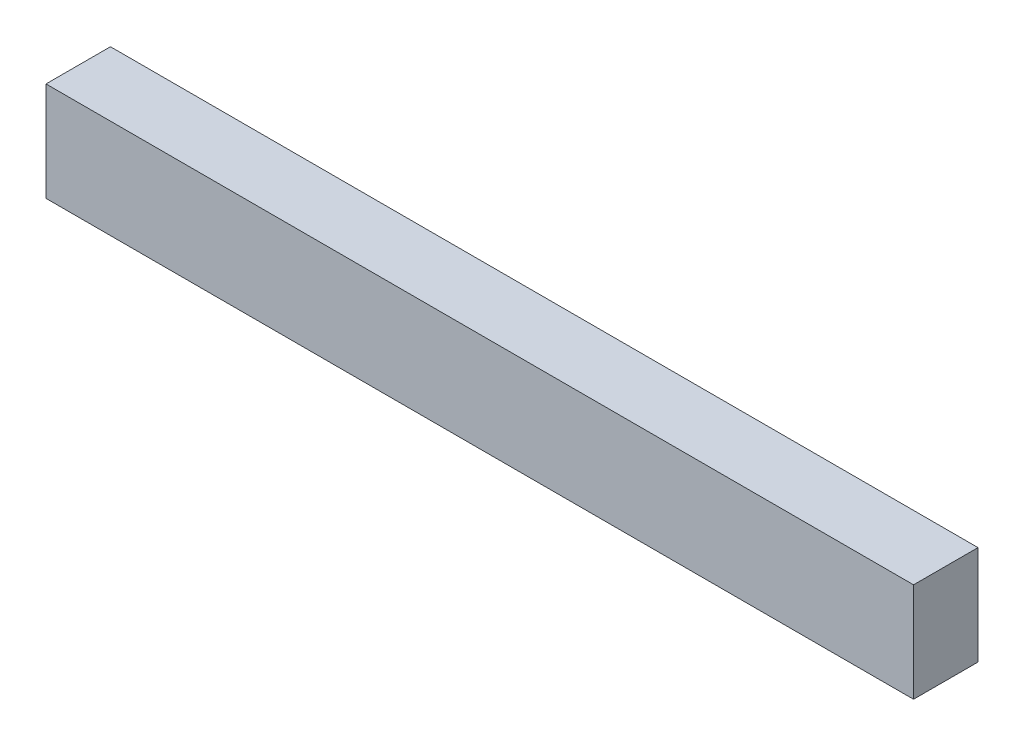
ISO-10303-21;
HEADER;
FILE_DESCRIPTION(('STEP AP214'),'2;1');
FILE_NAME('part.step','',(''),(''),'','','');
FILE_SCHEMA(('AUTOMOTIVE_DESIGN { 1 0 10303 214 1 1 1 1 }'));
ENDSEC;
DATA;
#1=APPLICATION_CONTEXT('core data for automotive mechanical design processes');
#2=APPLICATION_PROTOCOL_DEFINITION('international standard','automotive_design',2000,#1);
#3=PRODUCT_CONTEXT('',#1,'mechanical');
#4=PRODUCT('Part','Part','',(#3));
#5=PRODUCT_RELATED_PRODUCT_CATEGORY('part','',(#4));
#6=PRODUCT_DEFINITION_FORMATION('','',#4);
#7=PRODUCT_DEFINITION_CONTEXT('part definition',#1,'design');
#8=PRODUCT_DEFINITION('design','',#6,#7);
#9=PRODUCT_DEFINITION_SHAPE('','',#8);
#10=(LENGTH_UNIT() NAMED_UNIT(*) SI_UNIT(.MILLI.,.METRE.));
#11=(NAMED_UNIT(*) PLANE_ANGLE_UNIT() SI_UNIT($,.RADIAN.));
#12=(NAMED_UNIT(*) SI_UNIT($,.STERADIAN.) SOLID_ANGLE_UNIT());
#13=UNCERTAINTY_MEASURE_WITH_UNIT(LENGTH_MEASURE(1.E-05),#10,'distance_accuracy_value','');
#14=(GEOMETRIC_REPRESENTATION_CONTEXT(3) GLOBAL_UNCERTAINTY_ASSIGNED_CONTEXT((#13)) GLOBAL_UNIT_ASSIGNED_CONTEXT((#10,
#11,#12)) REPRESENTATION_CONTEXT('',''));
#15=CARTESIAN_POINT('',(0.,0.,0.));
#16=DIRECTION('',(0.,0.,1.));
#17=DIRECTION('',(1.,0.,0.));
#18=AXIS2_PLACEMENT_3D('',#15,#16,#17);
#19=CARTESIAN_POINT('',(17.5,-2.,2.6));
#20=DIRECTION('',(-1.,0.,0.));
#21=DIRECTION('',(0.,0.,1.));
#22=AXIS2_PLACEMENT_3D('',#19,#20,#21);
#23=PLANE('',#22);
#24=DIRECTION('',(0.,1.,0.));
#25=VECTOR('',#24,1.);
#26=CARTESIAN_POINT('',(17.5,-2.,0.));
#27=LINE('',#26,#25);
#28=CARTESIAN_POINT('',(17.5,-2.,0.));
#29=VERTEX_POINT('',#28);
#30=CARTESIAN_POINT('',(17.5,2.,0.));
#31=VERTEX_POINT('',#30);
#32=EDGE_CURVE('E107',#29,#31,#27,.T.);
#33=ORIENTED_EDGE('',*,*,#32,.T.);
#34=DIRECTION('',(0.,0.,-1.));
#35=VECTOR('',#34,1.);
#36=CARTESIAN_POINT('',(17.5,2.,2.6));
#37=LINE('',#36,#35);
#38=CARTESIAN_POINT('',(17.5,2.,2.6));
#39=VERTEX_POINT('',#38);
#40=EDGE_CURVE('E11',#39,#31,#37,.T.);
#41=ORIENTED_EDGE('',*,*,#40,.F.);
#42=DIRECTION('',(0.,1.,0.));
#43=VECTOR('',#42,1.);
#44=CARTESIAN_POINT('',(17.5,-2.,2.6));
#45=LINE('',#44,#43);
#46=CARTESIAN_POINT('',(17.5,-2.,2.6));
#47=VERTEX_POINT('',#46);
#48=EDGE_CURVE('E91',#47,#39,#45,.T.);
#49=ORIENTED_EDGE('',*,*,#48,.F.);
#50=DIRECTION('',(0.,0.,-1.));
#51=VECTOR('',#50,1.);
#52=CARTESIAN_POINT('',(17.5,-2.,2.6));
#53=LINE('',#52,#51);
#54=EDGE_CURVE('E103',#47,#29,#53,.T.);
#55=ORIENTED_EDGE('',*,*,#54,.T.);
#56=EDGE_LOOP('',(#33,#41,#49,#55));
#57=FACE_BOUND('',#56,.T.);
#58=ADVANCED_FACE('F39',(#57),#23,.F.);
#59=CARTESIAN_POINT('',(-17.5,2.,2.6));
#60=DIRECTION('',(0.,-1.,0.));
#61=DIRECTION('',(0.,0.,-1.));
#62=AXIS2_PLACEMENT_3D('',#59,#60,#61);
#63=PLANE('',#62);
#64=DIRECTION('',(-1.,0.,0.));
#65=VECTOR('',#64,1.);
#66=CARTESIAN_POINT('',(-17.5,2.,0.));
#67=LINE('',#66,#65);
#68=CARTESIAN_POINT('',(-17.5,2.,0.));
#69=VERTEX_POINT('',#68);
#70=EDGE_CURVE('E96',#31,#69,#67,.T.);
#71=ORIENTED_EDGE('',*,*,#70,.T.);
#72=DIRECTION('',(0.,0.,-1.));
#73=VECTOR('',#72,1.);
#74=CARTESIAN_POINT('',(-17.5,2.,2.6));
#75=LINE('',#74,#73);
#76=CARTESIAN_POINT('',(-17.5,2.,2.6));
#77=VERTEX_POINT('',#76);
#78=EDGE_CURVE('E48',#77,#69,#75,.T.);
#79=ORIENTED_EDGE('',*,*,#78,.F.);
#80=DIRECTION('',(-1.,0.,0.));
#81=VECTOR('',#80,1.);
#82=CARTESIAN_POINT('',(-17.5,2.,2.6));
#83=LINE('',#82,#81);
#84=EDGE_CURVE('E86',#39,#77,#83,.T.);
#85=ORIENTED_EDGE('',*,*,#84,.F.);
#86=ORIENTED_EDGE('',*,*,#40,.T.);
#87=EDGE_LOOP('',(#71,#79,#85,#86));
#88=FACE_BOUND('',#87,.T.);
#89=ADVANCED_FACE('F95',(#88),#63,.F.);
#90=CARTESIAN_POINT('',(-17.5,-2.,2.6));
#91=DIRECTION('',(1.,0.,0.));
#92=DIRECTION('',(0.,0.,-1.));
#93=AXIS2_PLACEMENT_3D('',#90,#91,#92);
#94=PLANE('',#93);
#95=DIRECTION('',(0.,-1.,0.));
#96=VECTOR('',#95,1.);
#97=CARTESIAN_POINT('',(-17.5,-2.,0.));
#98=LINE('',#97,#96);
#99=CARTESIAN_POINT('',(-17.5,-2.,0.));
#100=VERTEX_POINT('',#99);
#101=EDGE_CURVE('E73',#69,#100,#98,.T.);
#102=ORIENTED_EDGE('',*,*,#101,.T.);
#103=DIRECTION('',(0.,0.,-1.));
#104=VECTOR('',#103,1.);
#105=CARTESIAN_POINT('',(-17.5,-2.,2.6));
#106=LINE('',#105,#104);
#107=CARTESIAN_POINT('',(-17.5,-2.,2.6));
#108=VERTEX_POINT('',#107);
#109=EDGE_CURVE('E98',#108,#100,#106,.T.);
#110=ORIENTED_EDGE('',*,*,#109,.F.);
#111=DIRECTION('',(0.,-1.,0.));
#112=VECTOR('',#111,1.);
#113=CARTESIAN_POINT('',(-17.5,-2.,2.6));
#114=LINE('',#113,#112);
#115=EDGE_CURVE('E89',#77,#108,#114,.T.);
#116=ORIENTED_EDGE('',*,*,#115,.F.);
#117=ORIENTED_EDGE('',*,*,#78,.T.);
#118=EDGE_LOOP('',(#102,#110,#116,#117));
#119=FACE_BOUND('',#118,.T.);
#120=ADVANCED_FACE('F99',(#119),#94,.F.);
#121=CARTESIAN_POINT('',(-17.5,-2.,2.6));
#122=DIRECTION('',(0.,1.,0.));
#123=DIRECTION('',(0.,0.,1.));
#124=AXIS2_PLACEMENT_3D('',#121,#122,#123);
#125=PLANE('',#124);
#126=DIRECTION('',(1.,0.,0.));
#127=VECTOR('',#126,1.);
#128=CARTESIAN_POINT('',(-17.5,-2.,0.));
#129=LINE('',#128,#127);
#130=EDGE_CURVE('E79',#100,#29,#129,.T.);
#131=ORIENTED_EDGE('',*,*,#130,.T.);
#132=ORIENTED_EDGE('',*,*,#54,.F.);
#133=DIRECTION('',(1.,0.,0.));
#134=VECTOR('',#133,1.);
#135=CARTESIAN_POINT('',(-17.5,-2.,2.6));
#136=LINE('',#135,#134);
#137=EDGE_CURVE('E56',#108,#47,#136,.T.);
#138=ORIENTED_EDGE('',*,*,#137,.F.);
#139=ORIENTED_EDGE('',*,*,#109,.T.);
#140=EDGE_LOOP('',(#131,#132,#138,#139));
#141=FACE_BOUND('',#140,.T.);
#142=ADVANCED_FACE('F120',(#141),#125,.F.);
#143=CARTESIAN_POINT('',(0.,0.,2.6));
#144=DIRECTION('',(0.,0.,-1.));
#145=DIRECTION('',(-1.,0.,0.));
#146=AXIS2_PLACEMENT_3D('',#143,#144,#145);
#147=PLANE('',#146);
#148=ORIENTED_EDGE('',*,*,#48,.T.);
#149=ORIENTED_EDGE('',*,*,#84,.T.);
#150=ORIENTED_EDGE('',*,*,#115,.T.);
#151=ORIENTED_EDGE('',*,*,#137,.T.);
#152=EDGE_LOOP('',(#148,#149,#150,#151));
#153=FACE_BOUND('',#152,.T.);
#154=ADVANCED_FACE('F87',(#153),#147,.F.);
#155=CARTESIAN_POINT('',(0.,0.,0.));
#156=DIRECTION('',(0.,0.,-1.));
#157=DIRECTION('',(-1.,0.,0.));
#158=AXIS2_PLACEMENT_3D('',#155,#156,#157);
#159=PLANE('',#158);
#160=ORIENTED_EDGE('',*,*,#32,.F.);
#161=ORIENTED_EDGE('',*,*,#130,.F.);
#162=ORIENTED_EDGE('',*,*,#101,.F.);
#163=ORIENTED_EDGE('',*,*,#70,.F.);
#164=EDGE_LOOP('',(#160,#161,#162,#163));
#165=FACE_BOUND('',#164,.T.);
#166=ADVANCED_FACE('F123',(#165),#159,.T.);
#167=CLOSED_SHELL('',(#58,#89,#120,#142,#154,#166));
#168=MANIFOLD_SOLID_BREP('B2',#167);
#169=ADVANCED_BREP_SHAPE_REPRESENTATION('',(#18,#168),#14);
#170=SHAPE_DEFINITION_REPRESENTATION(#9,#169);
ENDSEC;
END-ISO-10303-21;
